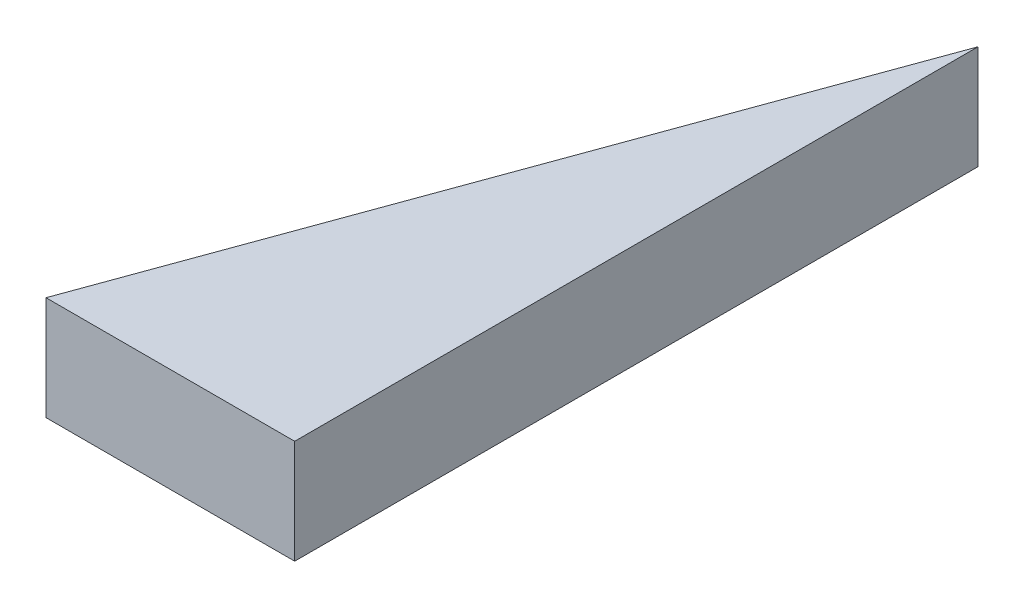
ISO-10303-21;
HEADER;
FILE_DESCRIPTION(('STEP AP214'),'2;1');
FILE_NAME('part.step','',(''),(''),'','','');
FILE_SCHEMA(('AUTOMOTIVE_DESIGN { 1 0 10303 214 1 1 1 1 }'));
ENDSEC;
DATA;
#1=APPLICATION_CONTEXT('core data for automotive mechanical design processes');
#2=APPLICATION_PROTOCOL_DEFINITION('international standard','automotive_design',2000,#1);
#3=PRODUCT_CONTEXT('',#1,'mechanical');
#4=PRODUCT('Part','Part','',(#3));
#5=PRODUCT_RELATED_PRODUCT_CATEGORY('part','',(#4));
#6=PRODUCT_DEFINITION_FORMATION('','',#4);
#7=PRODUCT_DEFINITION_CONTEXT('part definition',#1,'design');
#8=PRODUCT_DEFINITION('design','',#6,#7);
#9=PRODUCT_DEFINITION_SHAPE('','',#8);
#10=(LENGTH_UNIT() NAMED_UNIT(*) SI_UNIT(.MILLI.,.METRE.));
#11=(NAMED_UNIT(*) PLANE_ANGLE_UNIT() SI_UNIT($,.RADIAN.));
#12=(NAMED_UNIT(*) SI_UNIT($,.STERADIAN.) SOLID_ANGLE_UNIT());
#13=UNCERTAINTY_MEASURE_WITH_UNIT(LENGTH_MEASURE(1.E-05),#10,'distance_accuracy_value','');
#14=(GEOMETRIC_REPRESENTATION_CONTEXT(3) GLOBAL_UNCERTAINTY_ASSIGNED_CONTEXT((#13)) GLOBAL_UNIT_ASSIGNED_CONTEXT((#10,
#11,#12)) REPRESENTATION_CONTEXT('',''));
#15=CARTESIAN_POINT('',(0.,0.,0.));
#16=DIRECTION('',(0.,0.,1.));
#17=DIRECTION('',(1.,0.,0.));
#18=AXIS2_PLACEMENT_3D('',#15,#16,#17);
#19=CARTESIAN_POINT('',(30.4038,12.7,0.));
#20=DIRECTION('',(0.,0.,-1.));
#21=DIRECTION('',(-1.,0.,0.));
#22=AXIS2_PLACEMENT_3D('',#19,#20,#21);
#23=PLANE('',#22);
#24=DIRECTION('',(1.,0.,0.));
#25=VECTOR('',#24,1.);
#26=CARTESIAN_POINT('',(30.4038,0.,0.));
#27=LINE('',#26,#25);
#28=CARTESIAN_POINT('',(0.,0.,0.));
#29=VERTEX_POINT('',#28);
#30=CARTESIAN_POINT('',(30.4038,0.,0.));
#31=VERTEX_POINT('',#30);
#32=EDGE_CURVE('E80',#29,#31,#27,.T.);
#33=ORIENTED_EDGE('',*,*,#32,.T.);
#34=DIRECTION('',(0.,-1.,0.));
#35=VECTOR('',#34,1.);
#36=CARTESIAN_POINT('',(30.4038,12.7,0.));
#37=LINE('',#36,#35);
#38=CARTESIAN_POINT('',(30.4038,12.7,0.));
#39=VERTEX_POINT('',#38);
#40=EDGE_CURVE('E11',#39,#31,#37,.T.);
#41=ORIENTED_EDGE('',*,*,#40,.F.);
#42=DIRECTION('',(1.,0.,0.));
#43=VECTOR('',#42,1.);
#44=CARTESIAN_POINT('',(30.4038,12.7,0.));
#45=LINE('',#44,#43);
#46=CARTESIAN_POINT('',(0.,12.7,0.));
#47=VERTEX_POINT('',#46);
#48=EDGE_CURVE('E73',#47,#39,#45,.T.);
#49=ORIENTED_EDGE('',*,*,#48,.F.);
#50=DIRECTION('',(0.,-1.,0.));
#51=VECTOR('',#50,1.);
#52=CARTESIAN_POINT('',(0.,12.7,0.));
#53=LINE('',#52,#51);
#54=EDGE_CURVE('E81',#47,#29,#53,.T.);
#55=ORIENTED_EDGE('',*,*,#54,.T.);
#56=EDGE_LOOP('',(#33,#41,#49,#55));
#57=FACE_BOUND('',#56,.T.);
#58=ADVANCED_FACE('F33',(#57),#23,.F.);
#59=CARTESIAN_POINT('',(30.4038,12.7,-83.5406));
#60=DIRECTION('',(-1.,0.,0.));
#61=DIRECTION('',(0.,0.,1.));
#62=AXIS2_PLACEMENT_3D('',#59,#60,#61);
#63=PLANE('',#62);
#64=DIRECTION('',(0.,0.,-1.));
#65=VECTOR('',#64,1.);
#66=CARTESIAN_POINT('',(30.4038,0.,-83.5406));
#67=LINE('',#66,#65);
#68=CARTESIAN_POINT('',(30.4038,0.,-83.5406));
#69=VERTEX_POINT('',#68);
#70=EDGE_CURVE('E61',#31,#69,#67,.T.);
#71=ORIENTED_EDGE('',*,*,#70,.T.);
#72=DIRECTION('',(0.,-1.,0.));
#73=VECTOR('',#72,1.);
#74=CARTESIAN_POINT('',(30.4038,12.7,-83.5406));
#75=LINE('',#74,#73);
#76=CARTESIAN_POINT('',(30.4038,12.7,-83.5406));
#77=VERTEX_POINT('',#76);
#78=EDGE_CURVE('E41',#77,#69,#75,.T.);
#79=ORIENTED_EDGE('',*,*,#78,.F.);
#80=DIRECTION('',(0.,0.,-1.));
#81=VECTOR('',#80,1.);
#82=CARTESIAN_POINT('',(30.4038,12.7,-83.5406));
#83=LINE('',#82,#81);
#84=EDGE_CURVE('E69',#39,#77,#83,.T.);
#85=ORIENTED_EDGE('',*,*,#84,.F.);
#86=ORIENTED_EDGE('',*,*,#40,.T.);
#87=EDGE_LOOP('',(#71,#79,#85,#86));
#88=FACE_BOUND('',#87,.T.);
#89=ADVANCED_FACE('F70',(#88),#63,.F.);
#90=CARTESIAN_POINT('',(0.,12.7,0.));
#91=DIRECTION('',(0.939701628593917,0.,0.341995393562456));
#92=DIRECTION('',(0.341995393562456,0.,-0.939701628593917));
#93=AXIS2_PLACEMENT_3D('',#90,#91,#92);
#94=PLANE('',#93);
#95=DIRECTION('',(-0.341995393562456,0.,0.939701628593917));
#96=VECTOR('',#95,1.);
#97=CARTESIAN_POINT('',(0.,0.,0.));
#98=LINE('',#97,#96);
#99=EDGE_CURVE('E66',#69,#29,#98,.T.);
#100=ORIENTED_EDGE('',*,*,#99,.T.);
#101=ORIENTED_EDGE('',*,*,#54,.F.);
#102=DIRECTION('',(-0.341995393562456,0.,0.939701628593917));
#103=VECTOR('',#102,1.);
#104=CARTESIAN_POINT('',(0.,12.7,0.));
#105=LINE('',#104,#103);
#106=EDGE_CURVE('E49',#77,#47,#105,.T.);
#107=ORIENTED_EDGE('',*,*,#106,.F.);
#108=ORIENTED_EDGE('',*,*,#78,.T.);
#109=EDGE_LOOP('',(#100,#101,#107,#108));
#110=FACE_BOUND('',#109,.T.);
#111=ADVANCED_FACE('F88',(#110),#94,.F.);
#112=CARTESIAN_POINT('',(30.4038,12.7,0.));
#113=DIRECTION('',(0.,1.,0.));
#114=DIRECTION('',(0.,0.,1.));
#115=AXIS2_PLACEMENT_3D('',#112,#113,#114);
#116=PLANE('',#115);
#117=ORIENTED_EDGE('',*,*,#48,.T.);
#118=ORIENTED_EDGE('',*,*,#84,.T.);
#119=ORIENTED_EDGE('',*,*,#106,.T.);
#120=EDGE_LOOP('',(#117,#118,#119));
#121=FACE_BOUND('',#120,.T.);
#122=ADVANCED_FACE('F76',(#121),#116,.T.);
#123=CARTESIAN_POINT('',(30.4038,0.,0.));
#124=DIRECTION('',(0.,1.,0.));
#125=DIRECTION('',(0.,0.,1.));
#126=AXIS2_PLACEMENT_3D('',#123,#124,#125);
#127=PLANE('',#126);
#128=ORIENTED_EDGE('',*,*,#32,.F.);
#129=ORIENTED_EDGE('',*,*,#99,.F.);
#130=ORIENTED_EDGE('',*,*,#70,.F.);
#131=EDGE_LOOP('',(#128,#129,#130));
#132=FACE_BOUND('',#131,.T.);
#133=ADVANCED_FACE('F89',(#132),#127,.F.);
#134=CLOSED_SHELL('',(#58,#89,#111,#122,#133));
#135=MANIFOLD_SOLID_BREP('B2',#134);
#136=ADVANCED_BREP_SHAPE_REPRESENTATION('',(#18,#135),#14);
#137=SHAPE_DEFINITION_REPRESENTATION(#9,#136);
ENDSEC;
END-ISO-10303-21;
